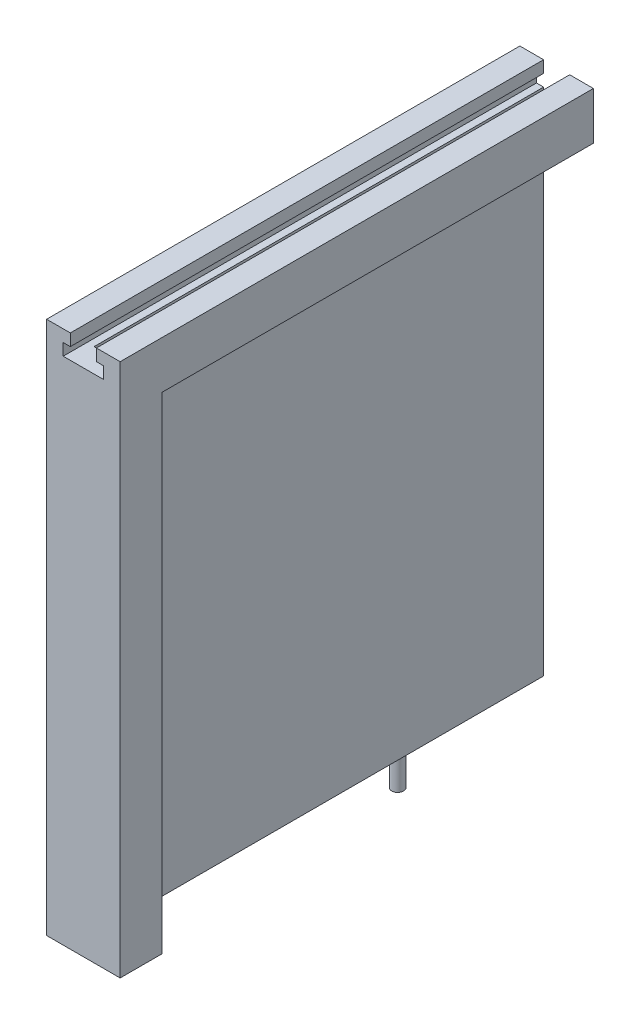
ISO-10303-21;
HEADER;
FILE_DESCRIPTION(('STEP AP214'),'2;1');
FILE_NAME('part.step','',(''),(''),'','','');
FILE_SCHEMA(('AUTOMOTIVE_DESIGN { 1 0 10303 214 1 1 1 1 }'));
ENDSEC;
DATA;
#1=APPLICATION_CONTEXT('core data for automotive mechanical design processes');
#2=APPLICATION_PROTOCOL_DEFINITION('international standard','automotive_design',2000,#1);
#3=PRODUCT_CONTEXT('',#1,'mechanical');
#4=PRODUCT('Part','Part','',(#3));
#5=PRODUCT_RELATED_PRODUCT_CATEGORY('part','',(#4));
#6=PRODUCT_DEFINITION_FORMATION('','',#4);
#7=PRODUCT_DEFINITION_CONTEXT('part definition',#1,'design');
#8=PRODUCT_DEFINITION('design','',#6,#7);
#9=PRODUCT_DEFINITION_SHAPE('','',#8);
#10=(LENGTH_UNIT() NAMED_UNIT(*) SI_UNIT(.MILLI.,.METRE.));
#11=(NAMED_UNIT(*) PLANE_ANGLE_UNIT() SI_UNIT($,.RADIAN.));
#12=(NAMED_UNIT(*) SI_UNIT($,.STERADIAN.) SOLID_ANGLE_UNIT());
#13=UNCERTAINTY_MEASURE_WITH_UNIT(LENGTH_MEASURE(1.E-05),#10,'distance_accuracy_value','');
#14=(GEOMETRIC_REPRESENTATION_CONTEXT(3) GLOBAL_UNCERTAINTY_ASSIGNED_CONTEXT((#13)) GLOBAL_UNIT_ASSIGNED_CONTEXT((#10,
#11,#12)) REPRESENTATION_CONTEXT('',''));
#15=CARTESIAN_POINT('',(0.,0.,0.));
#16=DIRECTION('',(0.,0.,1.));
#17=DIRECTION('',(1.,0.,0.));
#18=AXIS2_PLACEMENT_3D('',#15,#16,#17);
#19=CARTESIAN_POINT('',(0.,0.,-199.51));
#20=DIRECTION('',(0.,-1.,0.));
#21=DIRECTION('',(0.,0.,-1.));
#22=AXIS2_PLACEMENT_3D('',#19,#20,#21);
#23=PLANE('',#22);
#24=CARTESIAN_POINT('',(5.00000000000002,0.,56.5));
#25=DIRECTION('',(0.,-1.,0.));
#26=DIRECTION('',(0.,0.,-1.));
#27=AXIS2_PLACEMENT_3D('',#24,#25,#26);
#28=CIRCLE('',#27,2.5);
#29=CARTESIAN_POINT('',(5.00000000000002,0.,54.));
#30=VERTEX_POINT('',#29);
#31=EDGE_CURVE('E328',#30,#30,#28,.T.);
#32=ORIENTED_EDGE('',*,*,#31,.F.);
#33=EDGE_LOOP('',(#32));
#34=FACE_BOUND('',#33,.T.);
#35=CARTESIAN_POINT('',(5.,0.,169.5));
#36=DIRECTION('',(0.,-1.,0.));
#37=DIRECTION('',(0.,0.,-1.));
#38=AXIS2_PLACEMENT_3D('',#35,#36,#37);
#39=CIRCLE('',#38,2.5);
#40=CARTESIAN_POINT('',(5.,0.,167.));
#41=VERTEX_POINT('',#40);
#42=EDGE_CURVE('E325',#41,#41,#39,.T.);
#43=ORIENTED_EDGE('',*,*,#42,.F.);
#44=EDGE_LOOP('',(#43));
#45=FACE_BOUND('',#44,.T.);
#46=DIRECTION('',(0.,0.,1.));
#47=VECTOR('',#46,1.);
#48=CARTESIAN_POINT('',(0.,0.,0.));
#49=LINE('',#48,#47);
#50=CARTESIAN_POINT('',(0.,0.,0.));
#51=VERTEX_POINT('',#50);
#52=CARTESIAN_POINT('',(0.,0.,199.5));
#53=VERTEX_POINT('',#52);
#54=EDGE_CURVE('E250',#51,#53,#49,.T.);
#55=ORIENTED_EDGE('',*,*,#54,.F.);
#56=DIRECTION('',(1.,0.,0.));
#57=VECTOR('',#56,1.);
#58=CARTESIAN_POINT('',(0.,0.,0.));
#59=LINE('',#58,#57);
#60=CARTESIAN_POINT('',(10.,0.,0.));
#61=VERTEX_POINT('',#60);
#62=EDGE_CURVE('E61',#51,#61,#59,.T.);
#63=ORIENTED_EDGE('',*,*,#62,.T.);
#64=DIRECTION('',(0.,0.,1.));
#65=VECTOR('',#64,1.);
#66=CARTESIAN_POINT('',(10.,0.,0.));
#67=LINE('',#66,#65);
#68=CARTESIAN_POINT('',(10.,0.,189.5));
#69=VERTEX_POINT('',#68);
#70=EDGE_CURVE('E258',#61,#69,#67,.T.);
#71=ORIENTED_EDGE('',*,*,#70,.T.);
#72=DIRECTION('',(-1.,0.,0.));
#73=VECTOR('',#72,1.);
#74=CARTESIAN_POINT('',(21.,0.,189.5));
#75=LINE('',#74,#73);
#76=CARTESIAN_POINT('',(21.,0.,189.5));
#77=VERTEX_POINT('',#76);
#78=EDGE_CURVE('E242',#77,#69,#75,.T.);
#79=ORIENTED_EDGE('',*,*,#78,.F.);
#80=DIRECTION('',(0.,0.,1.));
#81=VECTOR('',#80,1.);
#82=CARTESIAN_POINT('',(21.,0.,0.));
#83=LINE('',#82,#81);
#84=CARTESIAN_POINT('',(21.,0.,181.766666666667));
#85=VERTEX_POINT('',#84);
#86=EDGE_CURVE('E247',#85,#77,#83,.T.);
#87=ORIENTED_EDGE('',*,*,#86,.F.);
#88=DIRECTION('',(-1.,0.,0.));
#89=VECTOR('',#88,1.);
#90=CARTESIAN_POINT('',(31.,0.,181.766666666667));
#91=LINE('',#90,#89);
#92=CARTESIAN_POINT('',(31.,0.,181.766666666667));
#93=VERTEX_POINT('',#92);
#94=EDGE_CURVE('E245',#93,#85,#91,.T.);
#95=ORIENTED_EDGE('',*,*,#94,.F.);
#96=DIRECTION('',(0.,0.,1.));
#97=VECTOR('',#96,1.);
#98=CARTESIAN_POINT('',(31.,0.,0.));
#99=LINE('',#98,#97);
#100=CARTESIAN_POINT('',(31.,0.,199.5));
#101=VERTEX_POINT('',#100);
#102=EDGE_CURVE('E255',#93,#101,#99,.T.);
#103=ORIENTED_EDGE('',*,*,#102,.T.);
#104=DIRECTION('',(-1.,0.,0.));
#105=VECTOR('',#104,1.);
#106=CARTESIAN_POINT('',(10.,0.,199.5));
#107=LINE('',#106,#105);
#108=EDGE_CURVE('E252',#101,#53,#107,.T.);
#109=ORIENTED_EDGE('',*,*,#108,.T.);
#110=EDGE_LOOP('',(#55,#63,#71,#79,#87,#95,#103,#109));
#111=FACE_BOUND('',#110,.T.);
#112=ADVANCED_FACE('F38',(#34,#45,#111),#23,.T.);
#113=CARTESIAN_POINT('',(31.,205.,-181.766666666667));
#114=DIRECTION('',(0.,-1.,0.));
#115=DIRECTION('',(0.,0.,-1.));
#116=AXIS2_PLACEMENT_3D('',#113,#114,#115);
#117=PLANE('',#116);
#118=DIRECTION('',(0.,0.,1.));
#119=VECTOR('',#118,1.);
#120=CARTESIAN_POINT('',(21.,205.,-181.766666666667));
#121=LINE('',#120,#119);
#122=CARTESIAN_POINT('',(21.,205.,0.));
#123=VERTEX_POINT('',#122);
#124=CARTESIAN_POINT('',(21.,205.,181.766666666667));
#125=VERTEX_POINT('',#124);
#126=EDGE_CURVE('E204',#123,#125,#121,.T.);
#127=ORIENTED_EDGE('',*,*,#126,.F.);
#128=DIRECTION('',(1.,0.,0.));
#129=VECTOR('',#128,1.);
#130=CARTESIAN_POINT('',(31.,205.,0.));
#131=LINE('',#130,#129);
#132=CARTESIAN_POINT('',(31.,205.,0.));
#133=VERTEX_POINT('',#132);
#134=EDGE_CURVE('E53',#123,#133,#131,.T.);
#135=ORIENTED_EDGE('',*,*,#134,.T.);
#136=DIRECTION('',(0.,0.,1.));
#137=VECTOR('',#136,1.);
#138=CARTESIAN_POINT('',(31.,205.,-181.766666666667));
#139=LINE('',#138,#137);
#140=CARTESIAN_POINT('',(31.,205.,181.766666666667));
#141=VERTEX_POINT('',#140);
#142=EDGE_CURVE('E208',#133,#141,#139,.T.);
#143=ORIENTED_EDGE('',*,*,#142,.T.);
#144=DIRECTION('',(-1.,0.,0.));
#145=VECTOR('',#144,1.);
#146=CARTESIAN_POINT('',(31.,205.,181.766666666667));
#147=LINE('',#146,#145);
#148=EDGE_CURVE('E200',#141,#125,#147,.T.);
#149=ORIENTED_EDGE('',*,*,#148,.T.);
#150=EDGE_LOOP('',(#127,#135,#143,#149));
#151=FACE_BOUND('',#150,.T.);
#152=ADVANCED_FACE('F280',(#151),#117,.T.);
#153=CARTESIAN_POINT('',(31.,0.,0.));
#154=DIRECTION('',(-1.,0.,0.));
#155=DIRECTION('',(0.,0.,1.));
#156=AXIS2_PLACEMENT_3D('',#153,#154,#155);
#157=PLANE('',#156);
#158=DIRECTION('',(0.,-1.,0.));
#159=VECTOR('',#158,1.);
#160=CARTESIAN_POINT('',(31.,0.,0.));
#161=LINE('',#160,#159);
#162=CARTESIAN_POINT('',(31.,225.,0.));
#163=VERTEX_POINT('',#162);
#164=EDGE_CURVE('E285',#163,#133,#161,.T.);
#165=ORIENTED_EDGE('',*,*,#164,.F.);
#166=DIRECTION('',(0.,0.,1.));
#167=VECTOR('',#166,1.);
#168=CARTESIAN_POINT('',(31.,225.,-199.5));
#169=LINE('',#168,#167);
#170=CARTESIAN_POINT('',(31.,225.,199.5));
#171=VERTEX_POINT('',#170);
#172=EDGE_CURVE('E198',#163,#171,#169,.T.);
#173=ORIENTED_EDGE('',*,*,#172,.T.);
#174=DIRECTION('',(0.,-1.,0.));
#175=VECTOR('',#174,1.);
#176=CARTESIAN_POINT('',(31.,-225.,199.5));
#177=LINE('',#176,#175);
#178=EDGE_CURVE('E194',#171,#101,#177,.T.);
#179=ORIENTED_EDGE('',*,*,#178,.T.);
#180=ORIENTED_EDGE('',*,*,#102,.F.);
#181=DIRECTION('',(0.,-1.,0.));
#182=VECTOR('',#181,1.);
#183=CARTESIAN_POINT('',(31.,-205.,181.766666666667));
#184=LINE('',#183,#182);
#185=EDGE_CURVE('E203',#141,#93,#184,.T.);
#186=ORIENTED_EDGE('',*,*,#185,.F.);
#187=ORIENTED_EDGE('',*,*,#142,.F.);
#188=EDGE_LOOP('',(#165,#173,#179,#180,#186,#187));
#189=FACE_BOUND('',#188,.T.);
#190=ADVANCED_FACE('F284',(#189),#157,.F.);
#191=CARTESIAN_POINT('',(6.99999999999996,0.,-189.5));
#192=DIRECTION('',(-1.,0.,0.));
#193=DIRECTION('',(0.,-1.,0.));
#194=AXIS2_PLACEMENT_3D('',#191,#192,#193);
#195=PLANE('',#194);
#196=DIRECTION('',(0.,-1.,0.));
#197=VECTOR('',#196,1.);
#198=CARTESIAN_POINT('',(6.99999999999996,0.,0.));
#199=LINE('',#198,#197);
#200=CARTESIAN_POINT('',(7.,220.,0.));
#201=VERTEX_POINT('',#200);
#202=CARTESIAN_POINT('',(7.,215.,0.));
#203=VERTEX_POINT('',#202);
#204=EDGE_CURVE('E646',#201,#203,#199,.T.);
#205=ORIENTED_EDGE('',*,*,#204,.F.);
#206=DIRECTION('',(0.,0.,1.));
#207=VECTOR('',#206,1.);
#208=CARTESIAN_POINT('',(7.,220.,-189.5));
#209=LINE('',#208,#207);
#210=CARTESIAN_POINT('',(7.,220.,199.5));
#211=VERTEX_POINT('',#210);
#212=EDGE_CURVE('E214',#201,#211,#209,.T.);
#213=ORIENTED_EDGE('',*,*,#212,.T.);
#214=DIRECTION('',(0.,-1.,0.));
#215=VECTOR('',#214,1.);
#216=CARTESIAN_POINT('',(6.99999999999996,0.,199.5));
#217=LINE('',#216,#215);
#218=CARTESIAN_POINT('',(7.,215.,199.5));
#219=VERTEX_POINT('',#218);
#220=EDGE_CURVE('E234',#211,#219,#217,.T.);
#221=ORIENTED_EDGE('',*,*,#220,.T.);
#222=DIRECTION('',(0.,0.,1.));
#223=VECTOR('',#222,1.);
#224=CARTESIAN_POINT('',(7.,215.,-189.5));
#225=LINE('',#224,#223);
#226=EDGE_CURVE('E216',#203,#219,#225,.T.);
#227=ORIENTED_EDGE('',*,*,#226,.F.);
#228=EDGE_LOOP('',(#205,#213,#221,#227));
#229=FACE_BOUND('',#228,.T.);
#230=ADVANCED_FACE('F371',(#229),#195,.F.);
#231=CARTESIAN_POINT('',(0.,220.,-189.5));
#232=DIRECTION('',(0.,1.,0.));
#233=DIRECTION('',(0.,0.,1.));
#234=AXIS2_PLACEMENT_3D('',#231,#232,#233);
#235=PLANE('',#234);
#236=DIRECTION('',(-1.,0.,0.));
#237=VECTOR('',#236,1.);
#238=CARTESIAN_POINT('',(0.,220.,0.));
#239=LINE('',#238,#237);
#240=CARTESIAN_POINT('',(10.,220.,0.));
#241=VERTEX_POINT('',#240);
#242=EDGE_CURVE('E644',#241,#201,#239,.T.);
#243=ORIENTED_EDGE('',*,*,#242,.F.);
#244=DIRECTION('',(0.,0.,1.));
#245=VECTOR('',#244,1.);
#246=CARTESIAN_POINT('',(10.,220.,-189.5));
#247=LINE('',#246,#245);
#248=CARTESIAN_POINT('',(10.,220.,199.5));
#249=VERTEX_POINT('',#248);
#250=EDGE_CURVE('E212',#241,#249,#247,.T.);
#251=ORIENTED_EDGE('',*,*,#250,.T.);
#252=DIRECTION('',(-1.,0.,0.));
#253=VECTOR('',#252,1.);
#254=CARTESIAN_POINT('',(0.,220.,199.5));
#255=LINE('',#254,#253);
#256=EDGE_CURVE('E237',#249,#211,#255,.T.);
#257=ORIENTED_EDGE('',*,*,#256,.T.);
#258=ORIENTED_EDGE('',*,*,#212,.F.);
#259=EDGE_LOOP('',(#243,#251,#257,#258));
#260=FACE_BOUND('',#259,.T.);
#261=ADVANCED_FACE('F369',(#260),#235,.F.);
#262=CARTESIAN_POINT('',(9.99999999999992,0.,-189.5));
#263=DIRECTION('',(-1.,0.,0.));
#264=DIRECTION('',(0.,-1.,0.));
#265=AXIS2_PLACEMENT_3D('',#262,#263,#264);
#266=PLANE('',#265);
#267=DIRECTION('',(0.,-1.,0.));
#268=VECTOR('',#267,1.);
#269=CARTESIAN_POINT('',(9.99999999999992,0.,0.));
#270=LINE('',#269,#268);
#271=CARTESIAN_POINT('',(10.,225.,0.));
#272=VERTEX_POINT('',#271);
#273=EDGE_CURVE('E173',#272,#241,#270,.T.);
#274=ORIENTED_EDGE('',*,*,#273,.F.);
#275=DIRECTION('',(0.,0.,1.));
#276=VECTOR('',#275,1.);
#277=CARTESIAN_POINT('',(10.,225.,-189.5));
#278=LINE('',#277,#276);
#279=CARTESIAN_POINT('',(10.,225.,199.5));
#280=VERTEX_POINT('',#279);
#281=EDGE_CURVE('E172',#272,#280,#278,.T.);
#282=ORIENTED_EDGE('',*,*,#281,.T.);
#283=DIRECTION('',(0.,-1.,0.));
#284=VECTOR('',#283,1.);
#285=CARTESIAN_POINT('',(9.99999999999992,0.,199.5));
#286=LINE('',#285,#284);
#287=EDGE_CURVE('E46',#280,#249,#286,.T.);
#288=ORIENTED_EDGE('',*,*,#287,.T.);
#289=ORIENTED_EDGE('',*,*,#250,.F.);
#290=EDGE_LOOP('',(#274,#282,#288,#289));
#291=FACE_BOUND('',#290,.T.);
#292=ADVANCED_FACE('F364',(#291),#266,.F.);
#293=CARTESIAN_POINT('',(10.,225.,-199.5));
#294=DIRECTION('',(0.,-1.,0.));
#295=DIRECTION('',(0.,0.,-1.));
#296=AXIS2_PLACEMENT_3D('',#293,#294,#295);
#297=PLANE('',#296);
#298=DIRECTION('',(1.,0.,0.));
#299=VECTOR('',#298,1.);
#300=CARTESIAN_POINT('',(10.,225.,0.));
#301=LINE('',#300,#299);
#302=CARTESIAN_POINT('',(0.,225.,0.));
#303=VERTEX_POINT('',#302);
#304=EDGE_CURVE('E161',#303,#272,#301,.T.);
#305=ORIENTED_EDGE('',*,*,#304,.F.);
#306=DIRECTION('',(0.,0.,1.));
#307=VECTOR('',#306,1.);
#308=CARTESIAN_POINT('',(0.,225.,-199.5));
#309=LINE('',#308,#307);
#310=CARTESIAN_POINT('',(0.,225.,199.5));
#311=VERTEX_POINT('',#310);
#312=EDGE_CURVE('E170',#303,#311,#309,.T.);
#313=ORIENTED_EDGE('',*,*,#312,.T.);
#314=DIRECTION('',(-1.,0.,0.));
#315=VECTOR('',#314,1.);
#316=CARTESIAN_POINT('',(10.,225.,199.5));
#317=LINE('',#316,#315);
#318=EDGE_CURVE('E186',#280,#311,#317,.T.);
#319=ORIENTED_EDGE('',*,*,#318,.F.);
#320=ORIENTED_EDGE('',*,*,#281,.F.);
#321=EDGE_LOOP('',(#305,#313,#319,#320));
#322=FACE_BOUND('',#321,.T.);
#323=ADVANCED_FACE('F168',(#322),#297,.F.);
#324=CARTESIAN_POINT('',(21.,225.,0.));
#325=VERTEX_POINT('',#324);
#326=EDGE_CURVE('E176',#325,#163,#301,.T.);
#327=ORIENTED_EDGE('',*,*,#326,.F.);
#328=DIRECTION('',(0.,0.,1.));
#329=VECTOR('',#328,1.);
#330=CARTESIAN_POINT('',(21.,225.,-189.5));
#331=LINE('',#330,#329);
#332=CARTESIAN_POINT('',(21.,225.,199.5));
#333=VERTEX_POINT('',#332);
#334=EDGE_CURVE('E206',#325,#333,#331,.T.);
#335=ORIENTED_EDGE('',*,*,#334,.T.);
#336=EDGE_CURVE('E189',#171,#333,#317,.T.);
#337=ORIENTED_EDGE('',*,*,#336,.F.);
#338=ORIENTED_EDGE('',*,*,#172,.F.);
#339=EDGE_LOOP('',(#327,#335,#337,#338));
#340=FACE_BOUND('',#339,.T.);
#341=ADVANCED_FACE('F363',(#340),#297,.F.);
#342=CARTESIAN_POINT('',(21.,0.,-189.5));
#343=DIRECTION('',(-1.,0.,0.));
#344=DIRECTION('',(0.,0.,1.));
#345=AXIS2_PLACEMENT_3D('',#342,#343,#344);
#346=PLANE('',#345);
#347=ORIENTED_EDGE('',*,*,#334,.F.);
#348=DIRECTION('',(0.,-1.,0.));
#349=VECTOR('',#348,1.);
#350=CARTESIAN_POINT('',(21.,0.,0.));
#351=LINE('',#350,#349);
#352=CARTESIAN_POINT('',(21.,220.,0.));
#353=VERTEX_POINT('',#352);
#354=EDGE_CURVE('E317',#325,#353,#351,.T.);
#355=ORIENTED_EDGE('',*,*,#354,.T.);
#356=DIRECTION('',(0.,0.,1.));
#357=VECTOR('',#356,1.);
#358=CARTESIAN_POINT('',(21.,220.,-189.5));
#359=LINE('',#358,#357);
#360=CARTESIAN_POINT('',(21.,220.,199.5));
#361=VERTEX_POINT('',#360);
#362=EDGE_CURVE('E222',#353,#361,#359,.T.);
#363=ORIENTED_EDGE('',*,*,#362,.T.);
#364=DIRECTION('',(0.,-1.,0.));
#365=VECTOR('',#364,1.);
#366=CARTESIAN_POINT('',(21.,0.,199.5));
#367=LINE('',#366,#365);
#368=EDGE_CURVE('E211',#333,#361,#367,.T.);
#369=ORIENTED_EDGE('',*,*,#368,.F.);
#370=EDGE_LOOP('',(#347,#355,#363,#369));
#371=FACE_BOUND('',#370,.T.);
#372=ADVANCED_FACE('F385',(#371),#346,.T.);
#373=DIRECTION('',(-1.,0.,0.));
#374=VECTOR('',#373,1.);
#375=CARTESIAN_POINT('',(0.,220.,0.));
#376=LINE('',#375,#374);
#377=CARTESIAN_POINT('',(24.,220.,0.));
#378=VERTEX_POINT('',#377);
#379=EDGE_CURVE('E315',#378,#353,#376,.T.);
#380=ORIENTED_EDGE('',*,*,#379,.F.);
#381=DIRECTION('',(0.,0.,1.));
#382=VECTOR('',#381,1.);
#383=CARTESIAN_POINT('',(24.,220.,-189.5));
#384=LINE('',#383,#382);
#385=CARTESIAN_POINT('',(24.,220.,199.5));
#386=VERTEX_POINT('',#385);
#387=EDGE_CURVE('E220',#378,#386,#384,.T.);
#388=ORIENTED_EDGE('',*,*,#387,.T.);
#389=EDGE_CURVE('E227',#386,#361,#255,.T.);
#390=ORIENTED_EDGE('',*,*,#389,.T.);
#391=ORIENTED_EDGE('',*,*,#362,.F.);
#392=EDGE_LOOP('',(#380,#388,#390,#391));
#393=FACE_BOUND('',#392,.T.);
#394=ADVANCED_FACE('F380',(#393),#235,.F.);
#395=CARTESIAN_POINT('',(24.,0.,-189.5));
#396=DIRECTION('',(-1.,0.,0.));
#397=DIRECTION('',(0.,0.,1.));
#398=AXIS2_PLACEMENT_3D('',#395,#396,#397);
#399=PLANE('',#398);
#400=ORIENTED_EDGE('',*,*,#387,.F.);
#401=DIRECTION('',(0.,-1.,0.));
#402=VECTOR('',#401,1.);
#403=CARTESIAN_POINT('',(24.,0.,0.));
#404=LINE('',#403,#402);
#405=CARTESIAN_POINT('',(24.,215.,0.));
#406=VERTEX_POINT('',#405);
#407=EDGE_CURVE('E309',#378,#406,#404,.T.);
#408=ORIENTED_EDGE('',*,*,#407,.T.);
#409=DIRECTION('',(0.,0.,1.));
#410=VECTOR('',#409,1.);
#411=CARTESIAN_POINT('',(24.,215.,-189.5));
#412=LINE('',#411,#410);
#413=CARTESIAN_POINT('',(24.,215.,199.5));
#414=VERTEX_POINT('',#413);
#415=EDGE_CURVE('E218',#406,#414,#412,.T.);
#416=ORIENTED_EDGE('',*,*,#415,.T.);
#417=DIRECTION('',(0.,-1.,0.));
#418=VECTOR('',#417,1.);
#419=CARTESIAN_POINT('',(24.,0.,199.5));
#420=LINE('',#419,#418);
#421=EDGE_CURVE('E228',#386,#414,#420,.T.);
#422=ORIENTED_EDGE('',*,*,#421,.F.);
#423=EDGE_LOOP('',(#400,#408,#416,#422));
#424=FACE_BOUND('',#423,.T.);
#425=ADVANCED_FACE('F377',(#424),#399,.T.);
#426=CARTESIAN_POINT('',(0.,215.,-189.5));
#427=DIRECTION('',(0.,1.,0.));
#428=DIRECTION('',(0.,0.,1.));
#429=AXIS2_PLACEMENT_3D('',#426,#427,#428);
#430=PLANE('',#429);
#431=ORIENTED_EDGE('',*,*,#415,.F.);
#432=DIRECTION('',(-1.,0.,0.));
#433=VECTOR('',#432,1.);
#434=CARTESIAN_POINT('',(0.,215.,0.));
#435=LINE('',#434,#433);
#436=CARTESIAN_POINT('',(21.,215.,0.));
#437=VERTEX_POINT('',#436);
#438=EDGE_CURVE('E305',#406,#437,#435,.T.);
#439=ORIENTED_EDGE('',*,*,#438,.T.);
#440=DIRECTION('',(0.,0.,1.));
#441=VECTOR('',#440,1.);
#442=CARTESIAN_POINT('',(21.,215.,-189.5));
#443=LINE('',#442,#441);
#444=CARTESIAN_POINT('',(21.,215.,189.5));
#445=VERTEX_POINT('',#444);
#446=EDGE_CURVE('E196',#437,#445,#443,.T.);
#447=ORIENTED_EDGE('',*,*,#446,.T.);
#448=DIRECTION('',(-1.,0.,0.));
#449=VECTOR('',#448,1.);
#450=CARTESIAN_POINT('',(21.,215.,189.5));
#451=LINE('',#450,#449);
#452=CARTESIAN_POINT('',(10.,215.,189.5));
#453=VERTEX_POINT('',#452);
#454=EDGE_CURVE('E181',#445,#453,#451,.T.);
#455=ORIENTED_EDGE('',*,*,#454,.T.);
#456=DIRECTION('',(0.,0.,1.));
#457=VECTOR('',#456,1.);
#458=CARTESIAN_POINT('',(10.,215.,-189.5));
#459=LINE('',#458,#457);
#460=CARTESIAN_POINT('',(10.,215.,0.));
#461=VERTEX_POINT('',#460);
#462=EDGE_CURVE('E192',#461,#453,#459,.T.);
#463=ORIENTED_EDGE('',*,*,#462,.F.);
#464=EDGE_CURVE('E307',#461,#203,#435,.T.);
#465=ORIENTED_EDGE('',*,*,#464,.T.);
#466=ORIENTED_EDGE('',*,*,#226,.T.);
#467=DIRECTION('',(-1.,0.,0.));
#468=VECTOR('',#467,1.);
#469=CARTESIAN_POINT('',(0.,215.,199.5));
#470=LINE('',#469,#468);
#471=EDGE_CURVE('E231',#414,#219,#470,.T.);
#472=ORIENTED_EDGE('',*,*,#471,.F.);
#473=EDGE_LOOP('',(#431,#439,#447,#455,#463,#465,#466,#472));
#474=FACE_BOUND('',#473,.T.);
#475=ADVANCED_FACE('F303',(#474),#430,.T.);
#476=CARTESIAN_POINT('',(21.,0.,0.));
#477=DIRECTION('',(-1.,0.,0.));
#478=DIRECTION('',(0.,0.,1.));
#479=AXIS2_PLACEMENT_3D('',#476,#477,#478);
#480=PLANE('',#479);
#481=ORIENTED_EDGE('',*,*,#446,.F.);
#482=DIRECTION('',(0.,-1.,0.));
#483=VECTOR('',#482,1.);
#484=CARTESIAN_POINT('',(21.,0.,0.));
#485=LINE('',#484,#483);
#486=EDGE_CURVE('E306',#437,#123,#485,.T.);
#487=ORIENTED_EDGE('',*,*,#486,.T.);
#488=ORIENTED_EDGE('',*,*,#126,.T.);
#489=DIRECTION('',(0.,-1.,0.));
#490=VECTOR('',#489,1.);
#491=CARTESIAN_POINT('',(21.,-205.,181.766666666667));
#492=LINE('',#491,#490);
#493=EDGE_CURVE('E207',#125,#85,#492,.T.);
#494=ORIENTED_EDGE('',*,*,#493,.T.);
#495=ORIENTED_EDGE('',*,*,#86,.T.);
#496=DIRECTION('',(0.,-1.,0.));
#497=VECTOR('',#496,1.);
#498=CARTESIAN_POINT('',(21.,-215.,189.5));
#499=LINE('',#498,#497);
#500=EDGE_CURVE('E184',#445,#77,#499,.T.);
#501=ORIENTED_EDGE('',*,*,#500,.F.);
#502=EDGE_LOOP('',(#481,#487,#488,#494,#495,#501));
#503=FACE_BOUND('',#502,.T.);
#504=ADVANCED_FACE('F271',(#503),#480,.T.);
#505=CARTESIAN_POINT('',(10.,0.,0.));
#506=DIRECTION('',(-1.,0.,0.));
#507=DIRECTION('',(0.,0.,1.));
#508=AXIS2_PLACEMENT_3D('',#505,#506,#507);
#509=PLANE('',#508);
#510=DIRECTION('',(0.,-1.,0.));
#511=VECTOR('',#510,1.);
#512=CARTESIAN_POINT('',(10.,0.,0.));
#513=LINE('',#512,#511);
#514=EDGE_CURVE('E299',#461,#61,#513,.T.);
#515=ORIENTED_EDGE('',*,*,#514,.F.);
#516=ORIENTED_EDGE('',*,*,#462,.T.);
#517=DIRECTION('',(0.,-1.,0.));
#518=VECTOR('',#517,1.);
#519=CARTESIAN_POINT('',(10.,-215.,189.5));
#520=LINE('',#519,#518);
#521=EDGE_CURVE('E195',#453,#69,#520,.T.);
#522=ORIENTED_EDGE('',*,*,#521,.T.);
#523=ORIENTED_EDGE('',*,*,#70,.F.);
#524=EDGE_LOOP('',(#515,#516,#522,#523));
#525=FACE_BOUND('',#524,.T.);
#526=ADVANCED_FACE('F297',(#525),#509,.F.);
#527=CARTESIAN_POINT('',(0.,0.,0.));
#528=DIRECTION('',(-1.,0.,0.));
#529=DIRECTION('',(0.,0.,1.));
#530=AXIS2_PLACEMENT_3D('',#527,#528,#529);
#531=PLANE('',#530);
#532=ORIENTED_EDGE('',*,*,#312,.F.);
#533=DIRECTION('',(0.,-1.,0.));
#534=VECTOR('',#533,1.);
#535=CARTESIAN_POINT('',(0.,0.,0.));
#536=LINE('',#535,#534);
#537=EDGE_CURVE('E11',#303,#51,#536,.T.);
#538=ORIENTED_EDGE('',*,*,#537,.T.);
#539=ORIENTED_EDGE('',*,*,#54,.T.);
#540=DIRECTION('',(0.,-1.,0.));
#541=VECTOR('',#540,1.);
#542=CARTESIAN_POINT('',(0.,-225.,199.5));
#543=LINE('',#542,#541);
#544=EDGE_CURVE('E180',#311,#53,#543,.T.);
#545=ORIENTED_EDGE('',*,*,#544,.F.);
#546=EDGE_LOOP('',(#532,#538,#539,#545));
#547=FACE_BOUND('',#546,.T.);
#548=ADVANCED_FACE('F178',(#547),#531,.T.);
#549=CARTESIAN_POINT('',(10.,-225.,199.5));
#550=DIRECTION('',(0.,0.,-1.));
#551=DIRECTION('',(-1.,0.,0.));
#552=AXIS2_PLACEMENT_3D('',#549,#550,#551);
#553=PLANE('',#552);
#554=ORIENTED_EDGE('',*,*,#108,.F.);
#555=ORIENTED_EDGE('',*,*,#178,.F.);
#556=ORIENTED_EDGE('',*,*,#336,.T.);
#557=ORIENTED_EDGE('',*,*,#368,.T.);
#558=ORIENTED_EDGE('',*,*,#389,.F.);
#559=ORIENTED_EDGE('',*,*,#421,.T.);
#560=ORIENTED_EDGE('',*,*,#471,.T.);
#561=ORIENTED_EDGE('',*,*,#220,.F.);
#562=ORIENTED_EDGE('',*,*,#256,.F.);
#563=ORIENTED_EDGE('',*,*,#287,.F.);
#564=ORIENTED_EDGE('',*,*,#318,.T.);
#565=ORIENTED_EDGE('',*,*,#544,.T.);
#566=EDGE_LOOP('',(#554,#555,#556,#557,#558,#559,#560,#561,#562,#563,#564,#565));
#567=FACE_BOUND('',#566,.T.);
#568=ADVANCED_FACE('F389',(#567),#553,.F.);
#569=CARTESIAN_POINT('',(21.,-215.,189.5));
#570=DIRECTION('',(0.,0.,-1.));
#571=DIRECTION('',(-1.,0.,0.));
#572=AXIS2_PLACEMENT_3D('',#569,#570,#571);
#573=PLANE('',#572);
#574=ORIENTED_EDGE('',*,*,#500,.T.);
#575=ORIENTED_EDGE('',*,*,#78,.T.);
#576=ORIENTED_EDGE('',*,*,#521,.F.);
#577=ORIENTED_EDGE('',*,*,#454,.F.);
#578=EDGE_LOOP('',(#574,#575,#576,#577));
#579=FACE_BOUND('',#578,.T.);
#580=ADVANCED_FACE('F40',(#579),#573,.T.);
#581=CARTESIAN_POINT('',(31.,-205.,181.766666666667));
#582=DIRECTION('',(0.,0.,-1.));
#583=DIRECTION('',(-1.,0.,0.));
#584=AXIS2_PLACEMENT_3D('',#581,#582,#583);
#585=PLANE('',#584);
#586=ORIENTED_EDGE('',*,*,#185,.T.);
#587=ORIENTED_EDGE('',*,*,#94,.T.);
#588=ORIENTED_EDGE('',*,*,#493,.F.);
#589=ORIENTED_EDGE('',*,*,#148,.F.);
#590=EDGE_LOOP('',(#586,#587,#588,#589));
#591=FACE_BOUND('',#590,.T.);
#592=ADVANCED_FACE('F277',(#591),#585,.T.);
#593=CARTESIAN_POINT('',(5.00000000000002,-15.,56.5));
#594=DIRECTION('',(0.,1.,0.));
#595=DIRECTION('',(0.,0.,1.));
#596=AXIS2_PLACEMENT_3D('',#593,#594,#595);
#597=CYLINDRICAL_SURFACE('',#596,2.5);
#598=CARTESIAN_POINT('',(5.00000000000002,-15.,56.5));
#599=DIRECTION('',(0.,-1.,0.));
#600=DIRECTION('',(0.,0.,-1.));
#601=AXIS2_PLACEMENT_3D('',#598,#599,#600);
#602=CIRCLE('',#601,2.5);
#603=CARTESIAN_POINT('',(5.00000000000002,-15.,54.));
#604=VERTEX_POINT('',#603);
#605=EDGE_CURVE('E322',#604,#604,#602,.T.);
#606=ORIENTED_EDGE('',*,*,#605,.F.);
#607=EDGE_LOOP('',(#606));
#608=FACE_BOUND('',#607,.T.);
#609=ORIENTED_EDGE('',*,*,#31,.T.);
#610=EDGE_LOOP('',(#609));
#611=FACE_BOUND('',#610,.T.);
#612=ADVANCED_FACE('F335',(#608,#611),#597,.T.);
#613=CARTESIAN_POINT('',(5.00000000000002,-15.,56.5));
#614=DIRECTION('',(0.,-1.,0.));
#615=DIRECTION('',(0.,0.,-1.));
#616=AXIS2_PLACEMENT_3D('',#613,#614,#615);
#617=PLANE('',#616);
#618=ORIENTED_EDGE('',*,*,#605,.T.);
#619=EDGE_LOOP('',(#618));
#620=FACE_BOUND('',#619,.T.);
#621=ADVANCED_FACE('F333',(#620),#617,.T.);
#622=CARTESIAN_POINT('',(5.,-15.,169.5));
#623=DIRECTION('',(0.,1.,0.));
#624=DIRECTION('',(0.,0.,1.));
#625=AXIS2_PLACEMENT_3D('',#622,#623,#624);
#626=CYLINDRICAL_SURFACE('',#625,2.5);
#627=CARTESIAN_POINT('',(5.,-15.,169.5));
#628=DIRECTION('',(0.,-1.,0.));
#629=DIRECTION('',(0.,0.,-1.));
#630=AXIS2_PLACEMENT_3D('',#627,#628,#629);
#631=CIRCLE('',#630,2.5);
#632=CARTESIAN_POINT('',(5.,-15.,167.));
#633=VERTEX_POINT('',#632);
#634=EDGE_CURVE('E259',#633,#633,#631,.T.);
#635=ORIENTED_EDGE('',*,*,#634,.F.);
#636=EDGE_LOOP('',(#635));
#637=FACE_BOUND('',#636,.T.);
#638=ORIENTED_EDGE('',*,*,#42,.T.);
#639=EDGE_LOOP('',(#638));
#640=FACE_BOUND('',#639,.T.);
#641=ADVANCED_FACE('F346',(#637,#640),#626,.T.);
#642=CARTESIAN_POINT('',(5.,-15.,169.5));
#643=DIRECTION('',(0.,-1.,0.));
#644=DIRECTION('',(0.,0.,-1.));
#645=AXIS2_PLACEMENT_3D('',#642,#643,#644);
#646=PLANE('',#645);
#647=ORIENTED_EDGE('',*,*,#634,.T.);
#648=EDGE_LOOP('',(#647));
#649=FACE_BOUND('',#648,.T.);
#650=ADVANCED_FACE('F348',(#649),#646,.T.);
#651=CARTESIAN_POINT('',(0.,0.,0.));
#652=DIRECTION('',(0.,0.,-1.));
#653=DIRECTION('',(-1.,0.,0.));
#654=AXIS2_PLACEMENT_3D('',#651,#652,#653);
#655=PLANE('',#654);
#656=CARTESIAN_POINT('',(5.,195.,0.));
#657=DIRECTION('',(0.,0.,1.));
#658=DIRECTION('',(1.,0.,0.));
#659=AXIS2_PLACEMENT_3D('',#656,#657,#658);
#660=CIRCLE('',#659,2.54999999999999);
#661=CARTESIAN_POINT('',(7.54999999999999,195.,0.));
#662=VERTEX_POINT('',#661);
#663=EDGE_CURVE('E663',#662,#662,#660,.T.);
#664=ORIENTED_EDGE('',*,*,#663,.T.);
#665=EDGE_LOOP('',(#664));
#666=FACE_BOUND('',#665,.T.);
#667=CARTESIAN_POINT('',(5.,30.,0.));
#668=DIRECTION('',(0.,0.,1.));
#669=DIRECTION('',(1.,0.,0.));
#670=AXIS2_PLACEMENT_3D('',#667,#668,#669);
#671=CIRCLE('',#670,2.55);
#672=CARTESIAN_POINT('',(7.55,30.,0.));
#673=VERTEX_POINT('',#672);
#674=EDGE_CURVE('E657',#673,#673,#671,.T.);
#675=ORIENTED_EDGE('',*,*,#674,.T.);
#676=EDGE_LOOP('',(#675));
#677=FACE_BOUND('',#676,.T.);
#678=ORIENTED_EDGE('',*,*,#514,.T.);
#679=ORIENTED_EDGE('',*,*,#62,.F.);
#680=ORIENTED_EDGE('',*,*,#537,.F.);
#681=ORIENTED_EDGE('',*,*,#304,.T.);
#682=ORIENTED_EDGE('',*,*,#273,.T.);
#683=ORIENTED_EDGE('',*,*,#242,.T.);
#684=ORIENTED_EDGE('',*,*,#204,.T.);
#685=ORIENTED_EDGE('',*,*,#464,.F.);
#686=EDGE_LOOP('',(#678,#679,#680,#681,#682,#683,#684,#685));
#687=FACE_BOUND('',#686,.T.);
#688=ADVANCED_FACE('F160',(#666,#677,#687),#655,.T.);
#689=CARTESIAN_POINT('',(26.,210.,0.));
#690=DIRECTION('',(0.,0.,1.));
#691=DIRECTION('',(1.,0.,0.));
#692=AXIS2_PLACEMENT_3D('',#689,#690,#691);
#693=CIRCLE('',#692,2.54999999999999);
#694=CARTESIAN_POINT('',(28.55,210.,0.));
#695=VERTEX_POINT('',#694);
#696=EDGE_CURVE('E666',#695,#695,#693,.T.);
#697=ORIENTED_EDGE('',*,*,#696,.T.);
#698=EDGE_LOOP('',(#697));
#699=FACE_BOUND('',#698,.T.);
#700=ORIENTED_EDGE('',*,*,#486,.F.);
#701=ORIENTED_EDGE('',*,*,#438,.F.);
#702=ORIENTED_EDGE('',*,*,#407,.F.);
#703=ORIENTED_EDGE('',*,*,#379,.T.);
#704=ORIENTED_EDGE('',*,*,#354,.F.);
#705=ORIENTED_EDGE('',*,*,#326,.T.);
#706=ORIENTED_EDGE('',*,*,#164,.T.);
#707=ORIENTED_EDGE('',*,*,#134,.F.);
#708=EDGE_LOOP('',(#700,#701,#702,#703,#704,#705,#706,#707));
#709=FACE_BOUND('',#708,.T.);
#710=ADVANCED_FACE('F416',(#699,#709),#655,.T.);
#711=CARTESIAN_POINT('',(26.,210.,15.));
#712=DIRECTION('',(0.,0.,-1.));
#713=DIRECTION('',(-1.,0.,0.));
#714=AXIS2_PLACEMENT_3D('',#711,#712,#713);
#715=CYLINDRICAL_SURFACE('',#714,2.54999999999999);
#716=CARTESIAN_POINT('',(26.,210.,15.));
#717=DIRECTION('',(0.,0.,1.));
#718=DIRECTION('',(1.,0.,0.));
#719=AXIS2_PLACEMENT_3D('',#716,#717,#718);
#720=CIRCLE('',#719,2.54999999999999);
#721=CARTESIAN_POINT('',(28.55,210.,15.));
#722=VERTEX_POINT('',#721);
#723=EDGE_CURVE('E174',#722,#722,#720,.T.);
#724=ORIENTED_EDGE('',*,*,#723,.T.);
#725=EDGE_LOOP('',(#724));
#726=FACE_BOUND('',#725,.T.);
#727=ORIENTED_EDGE('',*,*,#696,.F.);
#728=EDGE_LOOP('',(#727));
#729=FACE_BOUND('',#728,.T.);
#730=ADVANCED_FACE('F425',(#726,#729),#715,.F.);
#731=CARTESIAN_POINT('',(26.,210.,15.));
#732=DIRECTION('',(0.,0.,1.));
#733=DIRECTION('',(1.,0.,0.));
#734=AXIS2_PLACEMENT_3D('',#731,#732,#733);
#735=PLANE('',#734);
#736=ORIENTED_EDGE('',*,*,#723,.F.);
#737=EDGE_LOOP('',(#736));
#738=FACE_BOUND('',#737,.T.);
#739=ADVANCED_FACE('F433',(#738),#735,.F.);
#740=CARTESIAN_POINT('',(5.,30.,15.));
#741=DIRECTION('',(0.,0.,-1.));
#742=DIRECTION('',(-1.,0.,0.));
#743=AXIS2_PLACEMENT_3D('',#740,#741,#742);
#744=CYLINDRICAL_SURFACE('',#743,2.55);
#745=CARTESIAN_POINT('',(5.,30.,15.));
#746=DIRECTION('',(0.,0.,1.));
#747=DIRECTION('',(1.,0.,0.));
#748=AXIS2_PLACEMENT_3D('',#745,#746,#747);
#749=CIRCLE('',#748,2.55);
#750=CARTESIAN_POINT('',(7.55,30.,15.));
#751=VERTEX_POINT('',#750);
#752=EDGE_CURVE('E641',#751,#751,#749,.T.);
#753=ORIENTED_EDGE('',*,*,#752,.T.);
#754=EDGE_LOOP('',(#753));
#755=FACE_BOUND('',#754,.T.);
#756=ORIENTED_EDGE('',*,*,#674,.F.);
#757=EDGE_LOOP('',(#756));
#758=FACE_BOUND('',#757,.T.);
#759=ADVANCED_FACE('F442',(#755,#758),#744,.F.);
#760=CARTESIAN_POINT('',(5.,30.,15.));
#761=DIRECTION('',(0.,0.,1.));
#762=DIRECTION('',(1.,0.,0.));
#763=AXIS2_PLACEMENT_3D('',#760,#761,#762);
#764=PLANE('',#763);
#765=ORIENTED_EDGE('',*,*,#752,.F.);
#766=EDGE_LOOP('',(#765));
#767=FACE_BOUND('',#766,.T.);
#768=ADVANCED_FACE('F451',(#767),#764,.F.);
#769=CARTESIAN_POINT('',(5.,195.,15.));
#770=DIRECTION('',(0.,0.,-1.));
#771=DIRECTION('',(-1.,0.,0.));
#772=AXIS2_PLACEMENT_3D('',#769,#770,#771);
#773=CYLINDRICAL_SURFACE('',#772,2.54999999999999);
#774=CARTESIAN_POINT('',(5.,195.,15.));
#775=DIRECTION('',(0.,0.,1.));
#776=DIRECTION('',(1.,0.,0.));
#777=AXIS2_PLACEMENT_3D('',#774,#775,#776);
#778=CIRCLE('',#777,2.54999999999999);
#779=CARTESIAN_POINT('',(7.54999999999999,195.,15.));
#780=VERTEX_POINT('',#779);
#781=EDGE_CURVE('E660',#780,#780,#778,.T.);
#782=ORIENTED_EDGE('',*,*,#781,.T.);
#783=EDGE_LOOP('',(#782));
#784=FACE_BOUND('',#783,.T.);
#785=ORIENTED_EDGE('',*,*,#663,.F.);
#786=EDGE_LOOP('',(#785));
#787=FACE_BOUND('',#786,.T.);
#788=ADVANCED_FACE('F460',(#784,#787),#773,.F.);
#789=CARTESIAN_POINT('',(5.,195.,15.));
#790=DIRECTION('',(0.,0.,1.));
#791=DIRECTION('',(1.,0.,0.));
#792=AXIS2_PLACEMENT_3D('',#789,#790,#791);
#793=PLANE('',#792);
#794=ORIENTED_EDGE('',*,*,#781,.F.);
#795=EDGE_LOOP('',(#794));
#796=FACE_BOUND('',#795,.T.);
#797=ADVANCED_FACE('F469',(#796),#793,.F.);
#798=CLOSED_SHELL('',(#112,#152,#190,#230,#261,#292,#323,#341,#372,#394,#425,#475,#504,#526,
#548,#568,#580,#592,#612,#621,#641,#650,#688,#710,#730,#739,#759,#768,#788,#797));
#799=MANIFOLD_SOLID_BREP('B2',#798);
#800=ADVANCED_BREP_SHAPE_REPRESENTATION('',(#18,#799),#14);
#801=SHAPE_DEFINITION_REPRESENTATION(#9,#800);
ENDSEC;
END-ISO-10303-21;
